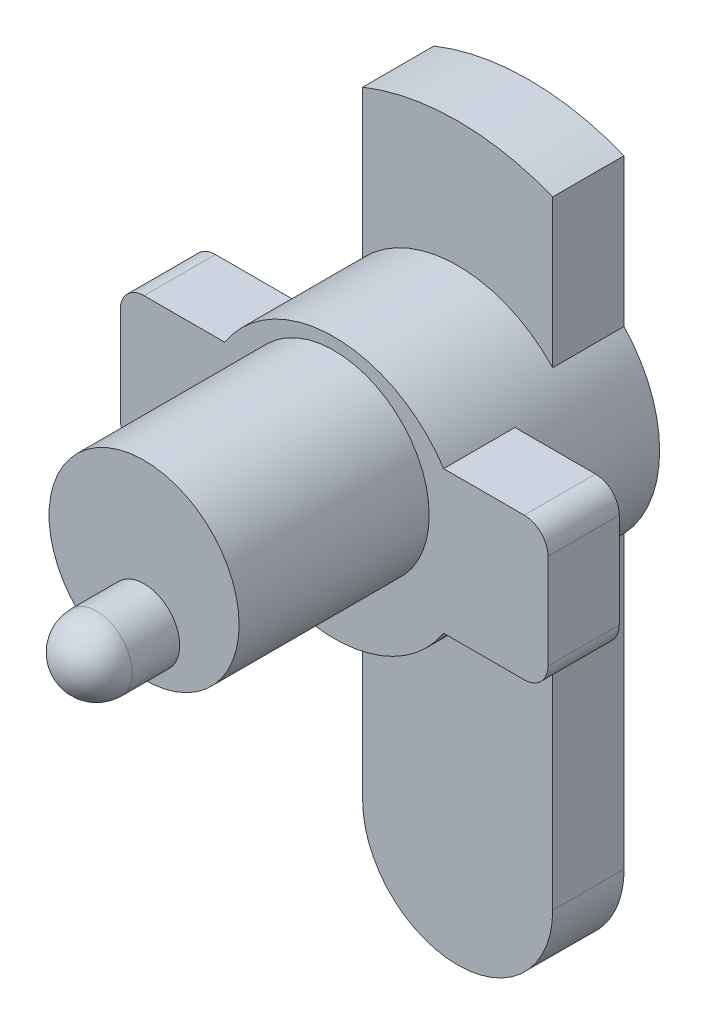
ISO-10303-21;
HEADER;
FILE_DESCRIPTION(('STEP AP214'),'2;1');
FILE_NAME('part.step','',(''),(''),'','','');
FILE_SCHEMA(('AUTOMOTIVE_DESIGN { 1 0 10303 214 1 1 1 1 }'));
ENDSEC;
DATA;
#1=APPLICATION_CONTEXT('core data for automotive mechanical design processes');
#2=APPLICATION_PROTOCOL_DEFINITION('international standard','automotive_design',2000,#1);
#3=PRODUCT_CONTEXT('',#1,'mechanical');
#4=PRODUCT('Part','Part','',(#3));
#5=PRODUCT_RELATED_PRODUCT_CATEGORY('part','',(#4));
#6=PRODUCT_DEFINITION_FORMATION('','',#4);
#7=PRODUCT_DEFINITION_CONTEXT('part definition',#1,'design');
#8=PRODUCT_DEFINITION('design','',#6,#7);
#9=PRODUCT_DEFINITION_SHAPE('','',#8);
#10=(LENGTH_UNIT() NAMED_UNIT(*) SI_UNIT(.MILLI.,.METRE.));
#11=(NAMED_UNIT(*) PLANE_ANGLE_UNIT() SI_UNIT($,.RADIAN.));
#12=(NAMED_UNIT(*) SI_UNIT($,.STERADIAN.) SOLID_ANGLE_UNIT());
#13=UNCERTAINTY_MEASURE_WITH_UNIT(LENGTH_MEASURE(1.E-05),#10,'distance_accuracy_value','');
#14=(GEOMETRIC_REPRESENTATION_CONTEXT(3) GLOBAL_UNCERTAINTY_ASSIGNED_CONTEXT((#13)) GLOBAL_UNIT_ASSIGNED_CONTEXT((#10,
#11,#12)) REPRESENTATION_CONTEXT('',''));
#15=CARTESIAN_POINT('',(0.,0.,0.));
#16=DIRECTION('',(0.,0.,1.));
#17=DIRECTION('',(1.,0.,0.));
#18=AXIS2_PLACEMENT_3D('',#15,#16,#17);
#19=CARTESIAN_POINT('',(0.,0.,0.));
#20=DIRECTION('',(0.,0.,1.));
#21=DIRECTION('',(1.,0.,0.));
#22=AXIS2_PLACEMENT_3D('',#19,#20,#21);
#23=PLANE('',#22);
#24=DIRECTION('',(0.,-1.,0.));
#25=VECTOR('',#24,1.);
#26=CARTESIAN_POINT('',(0.5,-9.5,0.));
#27=LINE('',#26,#25);
#28=CARTESIAN_POINT('',(0.5,-1.5,0.));
#29=VERTEX_POINT('',#28);
#30=CARTESIAN_POINT('',(0.5,-9.5,0.));
#31=VERTEX_POINT('',#30);
#32=EDGE_CURVE('E232',#29,#31,#27,.T.);
#33=ORIENTED_EDGE('',*,*,#32,.F.);
#34=CARTESIAN_POINT('',(0.,-1.5,0.));
#35=DIRECTION('',(0.,0.,-1.));
#36=DIRECTION('',(-1.,0.,0.));
#37=AXIS2_PLACEMENT_3D('',#34,#35,#36);
#38=CIRCLE('',#37,0.5);
#39=CARTESIAN_POINT('',(0.,-1.,0.));
#40=VERTEX_POINT('',#39);
#41=EDGE_CURVE('E234',#40,#29,#38,.T.);
#42=ORIENTED_EDGE('',*,*,#41,.F.);
#43=CARTESIAN_POINT('',(0.,0.5,0.));
#44=DIRECTION('',(0.,0.,-1.));
#45=DIRECTION('',(-1.,0.,0.));
#46=AXIS2_PLACEMENT_3D('',#43,#44,#45);
#47=CIRCLE('',#46,1.5);
#48=EDGE_CURVE('E231',#40,#40,#47,.T.);
#49=ORIENTED_EDGE('',*,*,#48,.F.);
#50=CARTESIAN_POINT('',(-0.5,-1.5,0.));
#51=VERTEX_POINT('',#50);
#52=EDGE_CURVE('E219',#51,#40,#38,.T.);
#53=ORIENTED_EDGE('',*,*,#52,.F.);
#54=DIRECTION('',(0.,1.,0.));
#55=VECTOR('',#54,1.);
#56=CARTESIAN_POINT('',(-0.5,-9.5,0.));
#57=LINE('',#56,#55);
#58=CARTESIAN_POINT('',(-0.5,-9.5,0.));
#59=VERTEX_POINT('',#58);
#60=EDGE_CURVE('E228',#59,#51,#57,.T.);
#61=ORIENTED_EDGE('',*,*,#60,.F.);
#62=CARTESIAN_POINT('',(0.,-9.5,0.));
#63=DIRECTION('',(0.,0.,-1.));
#64=DIRECTION('',(-1.,0.,0.));
#65=AXIS2_PLACEMENT_3D('',#62,#63,#64);
#66=CIRCLE('',#65,0.5);
#67=CARTESIAN_POINT('',(0.,-10.,0.));
#68=VERTEX_POINT('',#67);
#69=EDGE_CURVE('E240',#68,#59,#66,.T.);
#70=ORIENTED_EDGE('',*,*,#69,.F.);
#71=CARTESIAN_POINT('',(0.,-8.,0.));
#72=DIRECTION('',(0.,0.,1.));
#73=DIRECTION('',(-1.,0.,0.));
#74=AXIS2_PLACEMENT_3D('',#71,#72,#73);
#75=CIRCLE('',#74,2.);
#76=CARTESIAN_POINT('',(-2.,-8.,0.));
#77=VERTEX_POINT('',#76);
#78=EDGE_CURVE('E281',#77,#68,#75,.T.);
#79=ORIENTED_EDGE('',*,*,#78,.F.);
#80=DIRECTION('',(0.,-1.,0.));
#81=VECTOR('',#80,1.);
#82=CARTESIAN_POINT('',(-2.,-8.,0.));
#83=LINE('',#82,#81);
#84=CARTESIAN_POINT('',(-2.,-1.88745860881769,0.));
#85=VERTEX_POINT('',#84);
#86=EDGE_CURVE('E276',#85,#77,#83,.T.);
#87=ORIENTED_EDGE('',*,*,#86,.F.);
#88=CARTESIAN_POINT('',(0.,0.,0.));
#89=DIRECTION('',(0.,0.,1.));
#90=DIRECTION('',(1.,0.,0.));
#91=AXIS2_PLACEMENT_3D('',#88,#89,#90);
#92=CIRCLE('',#91,2.75);
#93=CARTESIAN_POINT('',(-2.,1.88745860881768,0.));
#94=VERTEX_POINT('',#93);
#95=EDGE_CURVE('E367',#94,#85,#92,.T.);
#96=ORIENTED_EDGE('',*,*,#95,.F.);
#97=CARTESIAN_POINT('',(-2.,5.,0.));
#98=VERTEX_POINT('',#97);
#99=EDGE_CURVE('E277',#98,#94,#83,.T.);
#100=ORIENTED_EDGE('',*,*,#99,.F.);
#101=CARTESIAN_POINT('',(0.,0.,0.));
#102=DIRECTION('',(0.,0.,1.));
#103=DIRECTION('',(-1.,0.,0.));
#104=AXIS2_PLACEMENT_3D('',#101,#102,#103);
#105=CIRCLE('',#104,5.3851648071345);
#106=CARTESIAN_POINT('',(2.,5.,0.));
#107=VERTEX_POINT('',#106);
#108=EDGE_CURVE('E258',#107,#98,#105,.T.);
#109=ORIENTED_EDGE('',*,*,#108,.F.);
#110=DIRECTION('',(0.,1.,0.));
#111=VECTOR('',#110,1.);
#112=CARTESIAN_POINT('',(2.,-8.,0.));
#113=LINE('',#112,#111);
#114=CARTESIAN_POINT('',(2.,1.88745860881769,0.));
#115=VERTEX_POINT('',#114);
#116=EDGE_CURVE('E284',#115,#107,#113,.T.);
#117=ORIENTED_EDGE('',*,*,#116,.F.);
#118=CARTESIAN_POINT('',(2.,-1.88745860881769,0.));
#119=VERTEX_POINT('',#118);
#120=EDGE_CURVE('E360',#119,#115,#92,.T.);
#121=ORIENTED_EDGE('',*,*,#120,.F.);
#122=CARTESIAN_POINT('',(2.,-8.,0.));
#123=VERTEX_POINT('',#122);
#124=EDGE_CURVE('E263',#123,#119,#113,.T.);
#125=ORIENTED_EDGE('',*,*,#124,.F.);
#126=EDGE_CURVE('E280',#68,#123,#75,.T.);
#127=ORIENTED_EDGE('',*,*,#126,.F.);
#128=EDGE_CURVE('E236',#31,#68,#66,.T.);
#129=ORIENTED_EDGE('',*,*,#128,.F.);
#130=EDGE_LOOP('',(#33,#42,#49,#53,#61,#70,#79,#87,#96,#100,#109,#117,#121,#125,#127,#129));
#131=FACE_BOUND('',#130,.T.);
#132=ADVANCED_FACE('F37',(#131),#23,.F.);
#133=CARTESIAN_POINT('',(0.,0.,4.1));
#134=DIRECTION('',(0.,0.,-1.));
#135=DIRECTION('',(-1.,0.,0.));
#136=AXIS2_PLACEMENT_3D('',#133,#134,#135);
#137=CYLINDRICAL_SURFACE('',#136,2.75);
#138=CARTESIAN_POINT('',(0.,0.,2.6));
#139=DIRECTION('',(0.,0.,-1.));
#140=DIRECTION('',(-1.,0.,0.));
#141=AXIS2_PLACEMENT_3D('',#138,#139,#140);
#142=CIRCLE('',#141,2.75);
#143=CARTESIAN_POINT('',(2.30488611432322,1.5,2.6));
#144=VERTEX_POINT('',#143);
#145=CARTESIAN_POINT('',(2.30488611432322,-1.5,2.6));
#146=VERTEX_POINT('',#145);
#147=EDGE_CURVE('E370',#144,#146,#142,.T.);
#148=ORIENTED_EDGE('',*,*,#147,.T.);
#149=DIRECTION('',(0.,0.,-1.));
#150=VECTOR('',#149,1.);
#151=CARTESIAN_POINT('',(2.30488611432322,-1.5,4.1));
#152=LINE('',#151,#150);
#153=CARTESIAN_POINT('',(2.30488611432322,-1.5,4.1));
#154=VERTEX_POINT('',#153);
#155=EDGE_CURVE('E354',#146,#154,#152,.F.);
#156=ORIENTED_EDGE('',*,*,#155,.T.);
#157=CARTESIAN_POINT('',(0.,0.,4.1));
#158=DIRECTION('',(0.,0.,1.));
#159=DIRECTION('',(1.,0.,0.));
#160=AXIS2_PLACEMENT_3D('',#157,#158,#159);
#161=CIRCLE('',#160,2.75);
#162=CARTESIAN_POINT('',(-2.30488611432322,-1.5,4.1));
#163=VERTEX_POINT('',#162);
#164=EDGE_CURVE('E365',#163,#154,#161,.T.);
#165=ORIENTED_EDGE('',*,*,#164,.F.);
#166=DIRECTION('',(0.,0.,-1.));
#167=VECTOR('',#166,1.);
#168=CARTESIAN_POINT('',(-2.30488611432322,-1.5,4.1));
#169=LINE('',#168,#167);
#170=CARTESIAN_POINT('',(-2.30488611432322,-1.5,2.6));
#171=VERTEX_POINT('',#170);
#172=EDGE_CURVE('E357',#163,#171,#169,.T.);
#173=ORIENTED_EDGE('',*,*,#172,.T.);
#174=CARTESIAN_POINT('',(-2.30488611432322,1.5,2.6));
#175=VERTEX_POINT('',#174);
#176=EDGE_CURVE('E364',#171,#175,#142,.T.);
#177=ORIENTED_EDGE('',*,*,#176,.T.);
#178=DIRECTION('',(0.,0.,-1.));
#179=VECTOR('',#178,1.);
#180=CARTESIAN_POINT('',(-2.30488611432322,1.5,4.1));
#181=LINE('',#180,#179);
#182=CARTESIAN_POINT('',(-2.30488611432322,1.5,4.1));
#183=VERTEX_POINT('',#182);
#184=EDGE_CURVE('E338',#175,#183,#181,.F.);
#185=ORIENTED_EDGE('',*,*,#184,.T.);
#186=CARTESIAN_POINT('',(2.30488611432322,1.5,4.1));
#187=VERTEX_POINT('',#186);
#188=EDGE_CURVE('E361',#187,#183,#161,.T.);
#189=ORIENTED_EDGE('',*,*,#188,.F.);
#190=DIRECTION('',(0.,0.,-1.));
#191=VECTOR('',#190,1.);
#192=CARTESIAN_POINT('',(2.30488611432322,1.5,4.1));
#193=LINE('',#192,#191);
#194=EDGE_CURVE('E351',#187,#144,#193,.T.);
#195=ORIENTED_EDGE('',*,*,#194,.T.);
#196=EDGE_LOOP('',(#148,#156,#165,#173,#177,#185,#189,#195));
#197=FACE_BOUND('',#196,.T.);
#198=DIRECTION('',(0.,0.,-1.));
#199=VECTOR('',#198,1.);
#200=CARTESIAN_POINT('',(-2.,1.88745860881769,4.1));
#201=LINE('',#200,#199);
#202=CARTESIAN_POINT('',(-2.,1.88745860881769,1.5));
#203=VERTEX_POINT('',#202);
#204=EDGE_CURVE('E304',#94,#203,#201,.F.);
#205=ORIENTED_EDGE('',*,*,#204,.F.);
#206=ORIENTED_EDGE('',*,*,#95,.T.);
#207=DIRECTION('',(0.,0.,-1.));
#208=VECTOR('',#207,1.);
#209=CARTESIAN_POINT('',(-2.,-1.88745860881769,4.1));
#210=LINE('',#209,#208);
#211=CARTESIAN_POINT('',(-2.,-1.88745860881769,1.5));
#212=VERTEX_POINT('',#211);
#213=EDGE_CURVE('E307',#212,#85,#210,.T.);
#214=ORIENTED_EDGE('',*,*,#213,.F.);
#215=CARTESIAN_POINT('',(0.,0.,1.5));
#216=DIRECTION('',(0.,0.,-1.));
#217=DIRECTION('',(-1.,0.,0.));
#218=AXIS2_PLACEMENT_3D('',#215,#216,#217);
#219=CIRCLE('',#218,2.75);
#220=CARTESIAN_POINT('',(2.,-1.88745860881769,1.5));
#221=VERTEX_POINT('',#220);
#222=EDGE_CURVE('E323',#221,#212,#219,.T.);
#223=ORIENTED_EDGE('',*,*,#222,.F.);
#224=DIRECTION('',(0.,0.,-1.));
#225=VECTOR('',#224,1.);
#226=CARTESIAN_POINT('',(2.,-1.88745860881769,4.1));
#227=LINE('',#226,#225);
#228=EDGE_CURVE('E298',#119,#221,#227,.F.);
#229=ORIENTED_EDGE('',*,*,#228,.F.);
#230=ORIENTED_EDGE('',*,*,#120,.T.);
#231=DIRECTION('',(0.,0.,-1.));
#232=VECTOR('',#231,1.);
#233=CARTESIAN_POINT('',(2.,1.88745860881769,4.1));
#234=LINE('',#233,#232);
#235=CARTESIAN_POINT('',(2.,1.88745860881769,1.5));
#236=VERTEX_POINT('',#235);
#237=EDGE_CURVE('E301',#236,#115,#234,.T.);
#238=ORIENTED_EDGE('',*,*,#237,.F.);
#239=EDGE_CURVE('E408',#203,#236,#219,.T.);
#240=ORIENTED_EDGE('',*,*,#239,.F.);
#241=EDGE_LOOP('',(#205,#206,#214,#223,#229,#230,#238,#240));
#242=FACE_BOUND('',#241,.T.);
#243=ADVANCED_FACE('F462',(#197,#242),#137,.T.);
#244=CARTESIAN_POINT('',(0.,0.,4.1));
#245=DIRECTION('',(0.,0.,1.));
#246=DIRECTION('',(1.,0.,0.));
#247=AXIS2_PLACEMENT_3D('',#244,#245,#246);
#248=PLANE('',#247);
#249=CARTESIAN_POINT('',(0.,0.5,4.1));
#250=DIRECTION('',(0.,0.,1.));
#251=DIRECTION('',(1.,0.,0.));
#252=AXIS2_PLACEMENT_3D('',#249,#250,#251);
#253=CIRCLE('',#252,2.);
#254=CARTESIAN_POINT('',(2.,0.5,4.1));
#255=VERTEX_POINT('',#254);
#256=EDGE_CURVE('E320',#255,#255,#253,.T.);
#257=ORIENTED_EDGE('',*,*,#256,.F.);
#258=EDGE_LOOP('',(#257));
#259=FACE_BOUND('',#258,.T.);
#260=DIRECTION('',(0.,-1.,0.));
#261=VECTOR('',#260,1.);
#262=CARTESIAN_POINT('',(-4.5,-1.5,4.1));
#263=LINE('',#262,#261);
#264=CARTESIAN_POINT('',(-4.5,1.,4.1));
#265=VERTEX_POINT('',#264);
#266=CARTESIAN_POINT('',(-4.5,-1.,4.1));
#267=VERTEX_POINT('',#266);
#268=EDGE_CURVE('E344',#265,#267,#263,.T.);
#269=ORIENTED_EDGE('',*,*,#268,.T.);
#270=CARTESIAN_POINT('',(-4.,-1.,4.1));
#271=DIRECTION('',(0.,0.,1.));
#272=DIRECTION('',(1.,0.,0.));
#273=AXIS2_PLACEMENT_3D('',#270,#271,#272);
#274=CIRCLE('',#273,0.5);
#275=CARTESIAN_POINT('',(-4.,-1.5,4.1));
#276=VERTEX_POINT('',#275);
#277=EDGE_CURVE('E382',#267,#276,#274,.T.);
#278=ORIENTED_EDGE('',*,*,#277,.T.);
#279=DIRECTION('',(1.,0.,0.));
#280=VECTOR('',#279,1.);
#281=CARTESIAN_POINT('',(-4.5,-1.5,4.1));
#282=LINE('',#281,#280);
#283=EDGE_CURVE('E329',#276,#163,#282,.T.);
#284=ORIENTED_EDGE('',*,*,#283,.T.);
#285=ORIENTED_EDGE('',*,*,#164,.T.);
#286=CARTESIAN_POINT('',(4.,-1.5,4.1));
#287=VERTEX_POINT('',#286);
#288=EDGE_CURVE('E347',#154,#287,#282,.T.);
#289=ORIENTED_EDGE('',*,*,#288,.T.);
#290=CARTESIAN_POINT('',(4.,-1.,4.1));
#291=DIRECTION('',(0.,0.,1.));
#292=DIRECTION('',(1.,0.,0.));
#293=AXIS2_PLACEMENT_3D('',#290,#291,#292);
#294=CIRCLE('',#293,0.5);
#295=CARTESIAN_POINT('',(4.5,-1.,4.1));
#296=VERTEX_POINT('',#295);
#297=EDGE_CURVE('E378',#287,#296,#294,.T.);
#298=ORIENTED_EDGE('',*,*,#297,.T.);
#299=DIRECTION('',(0.,1.,0.));
#300=VECTOR('',#299,1.);
#301=CARTESIAN_POINT('',(4.5,-1.5,4.1));
#302=LINE('',#301,#300);
#303=CARTESIAN_POINT('',(4.5,1.,4.1));
#304=VERTEX_POINT('',#303);
#305=EDGE_CURVE('E319',#296,#304,#302,.T.);
#306=ORIENTED_EDGE('',*,*,#305,.T.);
#307=CARTESIAN_POINT('',(4.,1.,4.1));
#308=DIRECTION('',(0.,0.,1.));
#309=DIRECTION('',(1.,0.,0.));
#310=AXIS2_PLACEMENT_3D('',#307,#308,#309);
#311=CIRCLE('',#310,0.5);
#312=CARTESIAN_POINT('',(4.,1.5,4.1));
#313=VERTEX_POINT('',#312);
#314=EDGE_CURVE('E376',#304,#313,#311,.T.);
#315=ORIENTED_EDGE('',*,*,#314,.T.);
#316=DIRECTION('',(-1.,0.,0.));
#317=VECTOR('',#316,1.);
#318=CARTESIAN_POINT('',(-4.5,1.5,4.1));
#319=LINE('',#318,#317);
#320=EDGE_CURVE('E342',#313,#187,#319,.T.);
#321=ORIENTED_EDGE('',*,*,#320,.T.);
#322=ORIENTED_EDGE('',*,*,#188,.T.);
#323=CARTESIAN_POINT('',(-4.,1.5,4.1));
#324=VERTEX_POINT('',#323);
#325=EDGE_CURVE('E341',#183,#324,#319,.T.);
#326=ORIENTED_EDGE('',*,*,#325,.T.);
#327=CARTESIAN_POINT('',(-4.,1.,4.1));
#328=DIRECTION('',(0.,0.,1.));
#329=DIRECTION('',(1.,0.,0.));
#330=AXIS2_PLACEMENT_3D('',#327,#328,#329);
#331=CIRCLE('',#330,0.5);
#332=EDGE_CURVE('E380',#324,#265,#331,.T.);
#333=ORIENTED_EDGE('',*,*,#332,.T.);
#334=EDGE_LOOP('',(#269,#278,#284,#285,#289,#298,#306,#315,#321,#322,#326,#333));
#335=FACE_BOUND('',#334,.T.);
#336=ADVANCED_FACE('F467',(#259,#335),#248,.T.);
#337=CARTESIAN_POINT('',(-4.5,-1.5,2.6));
#338=DIRECTION('',(-1.,0.,0.));
#339=DIRECTION('',(0.,0.,1.));
#340=AXIS2_PLACEMENT_3D('',#337,#338,#339);
#341=PLANE('',#340);
#342=DIRECTION('',(0.,-1.,0.));
#343=VECTOR('',#342,1.);
#344=CARTESIAN_POINT('',(-4.5,-1.5,2.6));
#345=LINE('',#344,#343);
#346=CARTESIAN_POINT('',(-4.5,1.,2.6));
#347=VERTEX_POINT('',#346);
#348=CARTESIAN_POINT('',(-4.5,-1.,2.6));
#349=VERTEX_POINT('',#348);
#350=EDGE_CURVE('E332',#347,#349,#345,.T.);
#351=ORIENTED_EDGE('',*,*,#350,.T.);
#352=DIRECTION('',(0.,0.,1.));
#353=VECTOR('',#352,1.);
#354=CARTESIAN_POINT('',(-4.5,-1.,2.6));
#355=LINE('',#354,#353);
#356=EDGE_CURVE('E373',#349,#267,#355,.T.);
#357=ORIENTED_EDGE('',*,*,#356,.T.);
#358=ORIENTED_EDGE('',*,*,#268,.F.);
#359=DIRECTION('',(0.,0.,1.));
#360=VECTOR('',#359,1.);
#361=CARTESIAN_POINT('',(-4.5,1.,2.6));
#362=LINE('',#361,#360);
#363=EDGE_CURVE('E371',#265,#347,#362,.F.);
#364=ORIENTED_EDGE('',*,*,#363,.T.);
#365=EDGE_LOOP('',(#351,#357,#358,#364));
#366=FACE_BOUND('',#365,.T.);
#367=ADVANCED_FACE('F645',(#366),#341,.T.);
#368=CARTESIAN_POINT('',(0.,0.,2.6));
#369=DIRECTION('',(0.,0.,-1.));
#370=DIRECTION('',(-1.,0.,0.));
#371=AXIS2_PLACEMENT_3D('',#368,#369,#370);
#372=PLANE('',#371);
#373=DIRECTION('',(1.,0.,0.));
#374=VECTOR('',#373,1.);
#375=CARTESIAN_POINT('',(-4.5,-1.5,2.6));
#376=LINE('',#375,#374);
#377=CARTESIAN_POINT('',(-4.,-1.5,2.6));
#378=VERTEX_POINT('',#377);
#379=EDGE_CURVE('E336',#378,#171,#376,.T.);
#380=ORIENTED_EDGE('',*,*,#379,.F.);
#381=CARTESIAN_POINT('',(-4.,-1.,2.6));
#382=DIRECTION('',(0.,0.,-1.));
#383=DIRECTION('',(-1.,0.,0.));
#384=AXIS2_PLACEMENT_3D('',#381,#382,#383);
#385=CIRCLE('',#384,0.5);
#386=EDGE_CURVE('E388',#378,#349,#385,.T.);
#387=ORIENTED_EDGE('',*,*,#386,.T.);
#388=ORIENTED_EDGE('',*,*,#350,.F.);
#389=CARTESIAN_POINT('',(-4.,1.,2.6));
#390=DIRECTION('',(0.,0.,-1.));
#391=DIRECTION('',(-1.,0.,0.));
#392=AXIS2_PLACEMENT_3D('',#389,#390,#391);
#393=CIRCLE('',#392,0.5);
#394=CARTESIAN_POINT('',(-4.,1.5,2.6));
#395=VERTEX_POINT('',#394);
#396=EDGE_CURVE('E386',#347,#395,#393,.T.);
#397=ORIENTED_EDGE('',*,*,#396,.T.);
#398=DIRECTION('',(-1.,0.,0.));
#399=VECTOR('',#398,1.);
#400=CARTESIAN_POINT('',(-4.5,1.5,2.6));
#401=LINE('',#400,#399);
#402=EDGE_CURVE('E328',#175,#395,#401,.T.);
#403=ORIENTED_EDGE('',*,*,#402,.F.);
#404=ORIENTED_EDGE('',*,*,#176,.F.);
#405=EDGE_LOOP('',(#380,#387,#388,#397,#403,#404));
#406=FACE_BOUND('',#405,.T.);
#407=ADVANCED_FACE('F641',(#406),#372,.T.);
#408=CARTESIAN_POINT('',(-4.5,1.5,2.6));
#409=DIRECTION('',(0.,1.,0.));
#410=DIRECTION('',(0.,0.,1.));
#411=AXIS2_PLACEMENT_3D('',#408,#409,#410);
#412=PLANE('',#411);
#413=ORIENTED_EDGE('',*,*,#402,.T.);
#414=DIRECTION('',(0.,0.,1.));
#415=VECTOR('',#414,1.);
#416=CARTESIAN_POINT('',(-4.,1.5,2.6));
#417=LINE('',#416,#415);
#418=EDGE_CURVE('E390',#395,#324,#417,.T.);
#419=ORIENTED_EDGE('',*,*,#418,.T.);
#420=ORIENTED_EDGE('',*,*,#325,.F.);
#421=ORIENTED_EDGE('',*,*,#184,.F.);
#422=EDGE_LOOP('',(#413,#419,#420,#421));
#423=FACE_BOUND('',#422,.T.);
#424=ADVANCED_FACE('F644',(#423),#412,.T.);
#425=CARTESIAN_POINT('',(-4.5,-1.5,2.6));
#426=DIRECTION('',(0.,-1.,0.));
#427=DIRECTION('',(0.,0.,-1.));
#428=AXIS2_PLACEMENT_3D('',#425,#426,#427);
#429=PLANE('',#428);
#430=ORIENTED_EDGE('',*,*,#283,.F.);
#431=DIRECTION('',(0.,0.,1.));
#432=VECTOR('',#431,1.);
#433=CARTESIAN_POINT('',(-4.,-1.5,2.6));
#434=LINE('',#433,#432);
#435=EDGE_CURVE('E384',#276,#378,#434,.F.);
#436=ORIENTED_EDGE('',*,*,#435,.T.);
#437=ORIENTED_EDGE('',*,*,#379,.T.);
#438=ORIENTED_EDGE('',*,*,#172,.F.);
#439=EDGE_LOOP('',(#430,#436,#437,#438));
#440=FACE_BOUND('',#439,.T.);
#441=ADVANCED_FACE('F648',(#440),#429,.T.);
#442=DIRECTION('',(0.,1.,0.));
#443=VECTOR('',#442,1.);
#444=CARTESIAN_POINT('',(4.5,-1.5,2.6));
#445=LINE('',#444,#443);
#446=CARTESIAN_POINT('',(4.5,-1.,2.6));
#447=VERTEX_POINT('',#446);
#448=CARTESIAN_POINT('',(4.5,1.,2.6));
#449=VERTEX_POINT('',#448);
#450=EDGE_CURVE('E325',#447,#449,#445,.T.);
#451=ORIENTED_EDGE('',*,*,#450,.F.);
#452=CARTESIAN_POINT('',(4.,-1.,2.6));
#453=DIRECTION('',(0.,0.,-1.));
#454=DIRECTION('',(-1.,0.,0.));
#455=AXIS2_PLACEMENT_3D('',#452,#453,#454);
#456=CIRCLE('',#455,0.5);
#457=CARTESIAN_POINT('',(4.,-1.5,2.6));
#458=VERTEX_POINT('',#457);
#459=EDGE_CURVE('E403',#447,#458,#456,.T.);
#460=ORIENTED_EDGE('',*,*,#459,.T.);
#461=EDGE_CURVE('E335',#146,#458,#376,.T.);
#462=ORIENTED_EDGE('',*,*,#461,.F.);
#463=ORIENTED_EDGE('',*,*,#147,.F.);
#464=CARTESIAN_POINT('',(4.,1.5,2.6));
#465=VERTEX_POINT('',#464);
#466=EDGE_CURVE('E330',#465,#144,#401,.T.);
#467=ORIENTED_EDGE('',*,*,#466,.F.);
#468=CARTESIAN_POINT('',(4.,1.,2.6));
#469=DIRECTION('',(0.,0.,-1.));
#470=DIRECTION('',(-1.,0.,0.));
#471=AXIS2_PLACEMENT_3D('',#468,#469,#470);
#472=CIRCLE('',#471,0.5);
#473=EDGE_CURVE('E401',#465,#449,#472,.T.);
#474=ORIENTED_EDGE('',*,*,#473,.T.);
#475=EDGE_LOOP('',(#451,#460,#462,#463,#467,#474));
#476=FACE_BOUND('',#475,.T.);
#477=ADVANCED_FACE('F647',(#476),#372,.T.);
#478=ORIENTED_EDGE('',*,*,#461,.T.);
#479=DIRECTION('',(0.,0.,1.));
#480=VECTOR('',#479,1.);
#481=CARTESIAN_POINT('',(4.,-1.5,2.6));
#482=LINE('',#481,#480);
#483=EDGE_CURVE('E393',#458,#287,#482,.T.);
#484=ORIENTED_EDGE('',*,*,#483,.T.);
#485=ORIENTED_EDGE('',*,*,#288,.F.);
#486=ORIENTED_EDGE('',*,*,#155,.F.);
#487=EDGE_LOOP('',(#478,#484,#485,#486));
#488=FACE_BOUND('',#487,.T.);
#489=ADVANCED_FACE('F652',(#488),#429,.T.);
#490=ORIENTED_EDGE('',*,*,#320,.F.);
#491=DIRECTION('',(0.,0.,1.));
#492=VECTOR('',#491,1.);
#493=CARTESIAN_POINT('',(4.,1.5,2.6));
#494=LINE('',#493,#492);
#495=EDGE_CURVE('E324',#313,#465,#494,.F.);
#496=ORIENTED_EDGE('',*,*,#495,.T.);
#497=ORIENTED_EDGE('',*,*,#466,.T.);
#498=ORIENTED_EDGE('',*,*,#194,.F.);
#499=EDGE_LOOP('',(#490,#496,#497,#498));
#500=FACE_BOUND('',#499,.T.);
#501=ADVANCED_FACE('F656',(#500),#412,.T.);
#502=CARTESIAN_POINT('',(4.5,-1.5,2.6));
#503=DIRECTION('',(1.,0.,0.));
#504=DIRECTION('',(0.,0.,-1.));
#505=AXIS2_PLACEMENT_3D('',#502,#503,#504);
#506=PLANE('',#505);
#507=ORIENTED_EDGE('',*,*,#305,.F.);
#508=DIRECTION('',(0.,0.,1.));
#509=VECTOR('',#508,1.);
#510=CARTESIAN_POINT('',(4.5,-1.,2.6));
#511=LINE('',#510,#509);
#512=EDGE_CURVE('E399',#296,#447,#511,.F.);
#513=ORIENTED_EDGE('',*,*,#512,.T.);
#514=ORIENTED_EDGE('',*,*,#450,.T.);
#515=DIRECTION('',(0.,0.,1.));
#516=VECTOR('',#515,1.);
#517=CARTESIAN_POINT('',(4.5,1.,2.6));
#518=LINE('',#517,#516);
#519=EDGE_CURVE('E396',#449,#304,#518,.T.);
#520=ORIENTED_EDGE('',*,*,#519,.T.);
#521=EDGE_LOOP('',(#507,#513,#514,#520));
#522=FACE_BOUND('',#521,.T.);
#523=ADVANCED_FACE('F477',(#522),#506,.T.);
#524=CARTESIAN_POINT('',(-4.,-1.,2.6));
#525=DIRECTION('',(0.,0.,1.));
#526=DIRECTION('',(1.,0.,0.));
#527=AXIS2_PLACEMENT_3D('',#524,#525,#526);
#528=CYLINDRICAL_SURFACE('',#527,0.5);
#529=ORIENTED_EDGE('',*,*,#386,.F.);
#530=ORIENTED_EDGE('',*,*,#435,.F.);
#531=ORIENTED_EDGE('',*,*,#277,.F.);
#532=ORIENTED_EDGE('',*,*,#356,.F.);
#533=EDGE_LOOP('',(#529,#530,#531,#532));
#534=FACE_BOUND('',#533,.T.);
#535=ADVANCED_FACE('F473',(#534),#528,.T.);
#536=CARTESIAN_POINT('',(-4.,1.,2.6));
#537=DIRECTION('',(0.,0.,1.));
#538=DIRECTION('',(1.,0.,0.));
#539=AXIS2_PLACEMENT_3D('',#536,#537,#538);
#540=CYLINDRICAL_SURFACE('',#539,0.5);
#541=ORIENTED_EDGE('',*,*,#396,.F.);
#542=ORIENTED_EDGE('',*,*,#363,.F.);
#543=ORIENTED_EDGE('',*,*,#332,.F.);
#544=ORIENTED_EDGE('',*,*,#418,.F.);
#545=EDGE_LOOP('',(#541,#542,#543,#544));
#546=FACE_BOUND('',#545,.T.);
#547=ADVANCED_FACE('F476',(#546),#540,.T.);
#548=CARTESIAN_POINT('',(4.,-1.,2.6));
#549=DIRECTION('',(0.,0.,1.));
#550=DIRECTION('',(1.,0.,0.));
#551=AXIS2_PLACEMENT_3D('',#548,#549,#550);
#552=CYLINDRICAL_SURFACE('',#551,0.5);
#553=ORIENTED_EDGE('',*,*,#459,.F.);
#554=ORIENTED_EDGE('',*,*,#512,.F.);
#555=ORIENTED_EDGE('',*,*,#297,.F.);
#556=ORIENTED_EDGE('',*,*,#483,.F.);
#557=EDGE_LOOP('',(#553,#554,#555,#556));
#558=FACE_BOUND('',#557,.T.);
#559=ADVANCED_FACE('F481',(#558),#552,.T.);
#560=CARTESIAN_POINT('',(4.,1.,2.6));
#561=DIRECTION('',(0.,0.,1.));
#562=DIRECTION('',(1.,0.,0.));
#563=AXIS2_PLACEMENT_3D('',#560,#561,#562);
#564=CYLINDRICAL_SURFACE('',#563,0.5);
#565=ORIENTED_EDGE('',*,*,#473,.F.);
#566=ORIENTED_EDGE('',*,*,#495,.F.);
#567=ORIENTED_EDGE('',*,*,#314,.F.);
#568=ORIENTED_EDGE('',*,*,#519,.F.);
#569=EDGE_LOOP('',(#565,#566,#567,#568));
#570=FACE_BOUND('',#569,.T.);
#571=ADVANCED_FACE('F485',(#570),#564,.T.);
#572=CARTESIAN_POINT('',(0.,0.5,8.1));
#573=DIRECTION('',(0.,0.,-1.));
#574=DIRECTION('',(-1.,0.,0.));
#575=AXIS2_PLACEMENT_3D('',#572,#573,#574);
#576=CYLINDRICAL_SURFACE('',#575,2.);
#577=CARTESIAN_POINT('',(0.,0.5,8.1));
#578=DIRECTION('',(0.,0.,1.));
#579=DIRECTION('',(1.,0.,0.));
#580=AXIS2_PLACEMENT_3D('',#577,#578,#579);
#581=CIRCLE('',#580,2.);
#582=CARTESIAN_POINT('',(2.,0.5,8.1));
#583=VERTEX_POINT('',#582);
#584=EDGE_CURVE('E314',#583,#583,#581,.T.);
#585=ORIENTED_EDGE('',*,*,#584,.F.);
#586=EDGE_LOOP('',(#585));
#587=FACE_BOUND('',#586,.T.);
#588=ORIENTED_EDGE('',*,*,#256,.T.);
#589=EDGE_LOOP('',(#588));
#590=FACE_BOUND('',#589,.T.);
#591=ADVANCED_FACE('F489',(#587,#590),#576,.T.);
#592=CARTESIAN_POINT('',(0.,0.5,8.1));
#593=DIRECTION('',(0.,0.,1.));
#594=DIRECTION('',(1.,0.,0.));
#595=AXIS2_PLACEMENT_3D('',#592,#593,#594);
#596=PLANE('',#595);
#597=CARTESIAN_POINT('',(0.,-0.5,8.1));
#598=DIRECTION('',(0.,0.,1.));
#599=DIRECTION('',(1.,0.,0.));
#600=AXIS2_PLACEMENT_3D('',#597,#598,#599);
#601=CIRCLE('',#600,0.75);
#602=CARTESIAN_POINT('',(0.75,-0.5,8.1));
#603=VERTEX_POINT('',#602);
#604=EDGE_CURVE('E310',#603,#603,#601,.T.);
#605=ORIENTED_EDGE('',*,*,#604,.F.);
#606=EDGE_LOOP('',(#605));
#607=FACE_BOUND('',#606,.T.);
#608=ORIENTED_EDGE('',*,*,#584,.T.);
#609=EDGE_LOOP('',(#608));
#610=FACE_BOUND('',#609,.T.);
#611=ADVANCED_FACE('F633',(#607,#610),#596,.T.);
#612=CARTESIAN_POINT('',(0.,-0.5,9.1));
#613=DIRECTION('',(0.,0.,-1.));
#614=DIRECTION('',(-1.,0.,0.));
#615=AXIS2_PLACEMENT_3D('',#612,#613,#614);
#616=CYLINDRICAL_SURFACE('',#615,0.75);
#617=CARTESIAN_POINT('',(0.,-0.5,9.1));
#618=DIRECTION('',(0.,0.,1.));
#619=DIRECTION('',(1.,0.,0.));
#620=AXIS2_PLACEMENT_3D('',#617,#618,#619);
#621=CIRCLE('',#620,0.75);
#622=CARTESIAN_POINT('',(0.75,-0.5,9.1));
#623=VERTEX_POINT('',#622);
#624=EDGE_CURVE('E311',#623,#623,#621,.T.);
#625=ORIENTED_EDGE('',*,*,#624,.F.);
#626=EDGE_LOOP('',(#625));
#627=FACE_BOUND('',#626,.T.);
#628=ORIENTED_EDGE('',*,*,#604,.T.);
#629=EDGE_LOOP('',(#628));
#630=FACE_BOUND('',#629,.T.);
#631=ADVANCED_FACE('F629',(#627,#630),#616,.T.);
#632=CARTESIAN_POINT('',(0.,-0.5,9.1));
#633=DIRECTION('',(0.,1.,0.));
#634=DIRECTION('',(-1.,0.,0.));
#635=AXIS2_PLACEMENT_3D('',#632,#633,#634);
#636=SPHERICAL_SURFACE('',#635,0.75);
#637=CARTESIAN_POINT('',(0.,-0.5,9.1));
#638=DIRECTION('',(0.,0.,1.));
#639=DIRECTION('',(1.,0.,0.));
#640=AXIS2_PLACEMENT_3D('',#637,#638,#639);
#641=SPHERICAL_SURFACE('',#640,0.75);
#642=ORIENTED_EDGE('',*,*,#624,.T.);
#643=EDGE_LOOP('',(#642));
#644=FACE_BOUND('',#643,.T.);
#645=ADVANCED_FACE('F569',(#644),#641,.T.);
#646=CARTESIAN_POINT('',(0.,-8.,1.5));
#647=DIRECTION('',(0.,0.,-1.));
#648=DIRECTION('',(-1.,0.,0.));
#649=AXIS2_PLACEMENT_3D('',#646,#647,#648);
#650=CYLINDRICAL_SURFACE('',#649,2.);
#651=ORIENTED_EDGE('',*,*,#78,.T.);
#652=ORIENTED_EDGE('',*,*,#126,.T.);
#653=DIRECTION('',(0.,0.,-1.));
#654=VECTOR('',#653,1.);
#655=CARTESIAN_POINT('',(2.,-8.,1.5));
#656=LINE('',#655,#654);
#657=CARTESIAN_POINT('',(2.,-8.,1.5));
#658=VERTEX_POINT('',#657);
#659=EDGE_CURVE('E289',#658,#123,#656,.T.);
#660=ORIENTED_EDGE('',*,*,#659,.F.);
#661=CARTESIAN_POINT('',(0.,-8.,1.5));
#662=DIRECTION('',(0.,0.,1.));
#663=DIRECTION('',(-1.,0.,0.));
#664=AXIS2_PLACEMENT_3D('',#661,#662,#663);
#665=CIRCLE('',#664,2.);
#666=CARTESIAN_POINT('',(-2.,-8.,1.5));
#667=VERTEX_POINT('',#666);
#668=EDGE_CURVE('E267',#667,#658,#665,.T.);
#669=ORIENTED_EDGE('',*,*,#668,.F.);
#670=DIRECTION('',(0.,0.,-1.));
#671=VECTOR('',#670,1.);
#672=CARTESIAN_POINT('',(-2.,-8.,1.5));
#673=LINE('',#672,#671);
#674=EDGE_CURVE('E292',#667,#77,#673,.T.);
#675=ORIENTED_EDGE('',*,*,#674,.T.);
#676=EDGE_LOOP('',(#651,#652,#660,#669,#675));
#677=FACE_BOUND('',#676,.T.);
#678=ADVANCED_FACE('F564',(#677),#650,.T.);
#679=CARTESIAN_POINT('',(0.,0.,1.5));
#680=DIRECTION('',(0.,0.,-1.));
#681=DIRECTION('',(-1.,0.,0.));
#682=AXIS2_PLACEMENT_3D('',#679,#680,#681);
#683=PLANE('',#682);
#684=DIRECTION('',(0.,1.,0.));
#685=VECTOR('',#684,1.);
#686=CARTESIAN_POINT('',(2.,-8.,1.5));
#687=LINE('',#686,#685);
#688=EDGE_CURVE('E270',#658,#221,#687,.T.);
#689=ORIENTED_EDGE('',*,*,#688,.T.);
#690=ORIENTED_EDGE('',*,*,#222,.T.);
#691=DIRECTION('',(0.,-1.,0.));
#692=VECTOR('',#691,1.);
#693=CARTESIAN_POINT('',(-2.,-8.,1.5));
#694=LINE('',#693,#692);
#695=EDGE_CURVE('E262',#212,#667,#694,.T.);
#696=ORIENTED_EDGE('',*,*,#695,.T.);
#697=ORIENTED_EDGE('',*,*,#668,.T.);
#698=EDGE_LOOP('',(#689,#690,#696,#697));
#699=FACE_BOUND('',#698,.T.);
#700=ADVANCED_FACE('F568',(#699),#683,.F.);
#701=CARTESIAN_POINT('',(2.,-8.,1.5));
#702=DIRECTION('',(-1.,0.,0.));
#703=DIRECTION('',(0.,0.,1.));
#704=AXIS2_PLACEMENT_3D('',#701,#702,#703);
#705=PLANE('',#704);
#706=ORIENTED_EDGE('',*,*,#124,.T.);
#707=ORIENTED_EDGE('',*,*,#228,.T.);
#708=ORIENTED_EDGE('',*,*,#688,.F.);
#709=ORIENTED_EDGE('',*,*,#659,.T.);
#710=EDGE_LOOP('',(#706,#707,#708,#709));
#711=FACE_BOUND('',#710,.T.);
#712=ADVANCED_FACE('F614',(#711),#705,.F.);
#713=CARTESIAN_POINT('',(-2.,-8.,1.5));
#714=DIRECTION('',(1.,0.,0.));
#715=DIRECTION('',(0.,0.,-1.));
#716=AXIS2_PLACEMENT_3D('',#713,#714,#715);
#717=PLANE('',#716);
#718=ORIENTED_EDGE('',*,*,#695,.F.);
#719=ORIENTED_EDGE('',*,*,#213,.T.);
#720=ORIENTED_EDGE('',*,*,#86,.T.);
#721=ORIENTED_EDGE('',*,*,#674,.F.);
#722=EDGE_LOOP('',(#718,#719,#720,#721));
#723=FACE_BOUND('',#722,.T.);
#724=ADVANCED_FACE('F622',(#723),#717,.F.);
#725=CARTESIAN_POINT('',(-2.,5.,1.5));
#726=VERTEX_POINT('',#725);
#727=EDGE_CURVE('E264',#726,#203,#694,.T.);
#728=ORIENTED_EDGE('',*,*,#727,.T.);
#729=ORIENTED_EDGE('',*,*,#239,.T.);
#730=CARTESIAN_POINT('',(2.,5.,1.5));
#731=VERTEX_POINT('',#730);
#732=EDGE_CURVE('E269',#236,#731,#687,.T.);
#733=ORIENTED_EDGE('',*,*,#732,.T.);
#734=CARTESIAN_POINT('',(0.,0.,1.5));
#735=DIRECTION('',(0.,0.,1.));
#736=DIRECTION('',(-1.,0.,0.));
#737=AXIS2_PLACEMENT_3D('',#734,#735,#736);
#738=CIRCLE('',#737,5.3851648071345);
#739=EDGE_CURVE('E259',#731,#726,#738,.T.);
#740=ORIENTED_EDGE('',*,*,#739,.T.);
#741=EDGE_LOOP('',(#728,#729,#733,#740));
#742=FACE_BOUND('',#741,.T.);
#743=ADVANCED_FACE('F616',(#742),#683,.F.);
#744=ORIENTED_EDGE('',*,*,#99,.T.);
#745=ORIENTED_EDGE('',*,*,#204,.T.);
#746=ORIENTED_EDGE('',*,*,#727,.F.);
#747=DIRECTION('',(0.,0.,-1.));
#748=VECTOR('',#747,1.);
#749=CARTESIAN_POINT('',(-2.,5.,1.5));
#750=LINE('',#749,#748);
#751=EDGE_CURVE('E295',#726,#98,#750,.T.);
#752=ORIENTED_EDGE('',*,*,#751,.T.);
#753=EDGE_LOOP('',(#744,#745,#746,#752));
#754=FACE_BOUND('',#753,.T.);
#755=ADVANCED_FACE('F619',(#754),#717,.F.);
#756=ORIENTED_EDGE('',*,*,#732,.F.);
#757=ORIENTED_EDGE('',*,*,#237,.T.);
#758=ORIENTED_EDGE('',*,*,#116,.T.);
#759=DIRECTION('',(0.,0.,-1.));
#760=VECTOR('',#759,1.);
#761=CARTESIAN_POINT('',(2.,5.,1.5));
#762=LINE('',#761,#760);
#763=EDGE_CURVE('E273',#731,#107,#762,.T.);
#764=ORIENTED_EDGE('',*,*,#763,.F.);
#765=EDGE_LOOP('',(#756,#757,#758,#764));
#766=FACE_BOUND('',#765,.T.);
#767=ADVANCED_FACE('F617',(#766),#705,.F.);
#768=CARTESIAN_POINT('',(0.,0.,1.5));
#769=DIRECTION('',(0.,0.,-1.));
#770=DIRECTION('',(-1.,0.,0.));
#771=AXIS2_PLACEMENT_3D('',#768,#769,#770);
#772=CYLINDRICAL_SURFACE('',#771,5.3851648071345);
#773=ORIENTED_EDGE('',*,*,#108,.T.);
#774=ORIENTED_EDGE('',*,*,#751,.F.);
#775=ORIENTED_EDGE('',*,*,#739,.F.);
#776=ORIENTED_EDGE('',*,*,#763,.T.);
#777=EDGE_LOOP('',(#773,#774,#775,#776));
#778=FACE_BOUND('',#777,.T.);
#779=ADVANCED_FACE('F611',(#778),#772,.T.);
#780=CARTESIAN_POINT('',(0.,0.,3.1));
#781=DIRECTION('',(0.,0.,1.));
#782=DIRECTION('',(1.,0.,0.));
#783=AXIS2_PLACEMENT_3D('',#780,#781,#782);
#784=PLANE('',#783);
#785=CARTESIAN_POINT('',(0.,0.5,3.1));
#786=DIRECTION('',(0.,0.,-1.));
#787=DIRECTION('',(-1.,0.,0.));
#788=AXIS2_PLACEMENT_3D('',#785,#786,#787);
#789=CIRCLE('',#788,0.5);
#790=CARTESIAN_POINT('',(-0.5,0.5,3.1));
#791=VERTEX_POINT('',#790);
#792=EDGE_CURVE('E248',#791,#791,#789,.T.);
#793=ORIENTED_EDGE('',*,*,#792,.F.);
#794=EDGE_LOOP('',(#793));
#795=FACE_BOUND('',#794,.T.);
#796=CARTESIAN_POINT('',(0.,0.5,3.1));
#797=DIRECTION('',(0.,0.,1.));
#798=DIRECTION('',(1.,0.,0.));
#799=AXIS2_PLACEMENT_3D('',#796,#797,#798);
#800=CIRCLE('',#799,1.5);
#801=CARTESIAN_POINT('',(1.5,0.5,3.1));
#802=VERTEX_POINT('',#801);
#803=EDGE_CURVE('E255',#802,#802,#800,.F.);
#804=ORIENTED_EDGE('',*,*,#803,.T.);
#805=EDGE_LOOP('',(#804));
#806=FACE_BOUND('',#805,.T.);
#807=ADVANCED_FACE('F584',(#795,#806),#784,.F.);
#808=CARTESIAN_POINT('',(0.,0.5,8.34264068711929));
#809=DIRECTION('',(0.,0.,-1.));
#810=DIRECTION('',(-1.,0.,0.));
#811=AXIS2_PLACEMENT_3D('',#808,#809,#810);
#812=CYLINDRICAL_SURFACE('',#811,1.5);
#813=ORIENTED_EDGE('',*,*,#48,.T.);
#814=EDGE_LOOP('',(#813));
#815=FACE_BOUND('',#814,.T.);
#816=ORIENTED_EDGE('',*,*,#803,.F.);
#817=EDGE_LOOP('',(#816));
#818=FACE_BOUND('',#817,.T.);
#819=ADVANCED_FACE('F579',(#815,#818),#812,.F.);
#820=CARTESIAN_POINT('',(0.,0.5,7.1));
#821=DIRECTION('',(0.,0.,1.));
#822=DIRECTION('',(1.,0.,0.));
#823=AXIS2_PLACEMENT_3D('',#820,#821,#822);
#824=PLANE('',#823);
#825=CARTESIAN_POINT('',(0.,0.5,7.1));
#826=DIRECTION('',(0.,0.,1.));
#827=DIRECTION('',(1.,0.,0.));
#828=AXIS2_PLACEMENT_3D('',#825,#826,#827);
#829=CIRCLE('',#828,0.5);
#830=CARTESIAN_POINT('',(0.5,0.5,7.1));
#831=VERTEX_POINT('',#830);
#832=EDGE_CURVE('E251',#831,#831,#829,.F.);
#833=ORIENTED_EDGE('',*,*,#832,.T.);
#834=EDGE_LOOP('',(#833));
#835=FACE_BOUND('',#834,.T.);
#836=ADVANCED_FACE('F583',(#835),#824,.F.);
#837=CARTESIAN_POINT('',(0.,0.5,9.5142135623731));
#838=DIRECTION('',(0.,0.,-1.));
#839=DIRECTION('',(-1.,0.,0.));
#840=AXIS2_PLACEMENT_3D('',#837,#838,#839);
#841=CYLINDRICAL_SURFACE('',#840,0.5);
#842=ORIENTED_EDGE('',*,*,#792,.T.);
#843=EDGE_LOOP('',(#842));
#844=FACE_BOUND('',#843,.T.);
#845=ORIENTED_EDGE('',*,*,#832,.F.);
#846=EDGE_LOOP('',(#845));
#847=FACE_BOUND('',#846,.T.);
#848=ADVANCED_FACE('F548',(#844,#847),#841,.F.);
#849=CARTESIAN_POINT('',(0.,-9.5,-0.3));
#850=DIRECTION('',(0.,0.,1.));
#851=DIRECTION('',(1.,0.,0.));
#852=AXIS2_PLACEMENT_3D('',#849,#850,#851);
#853=CYLINDRICAL_SURFACE('',#852,0.5);
#854=DIRECTION('',(0.,0.,1.));
#855=VECTOR('',#854,1.);
#856=CARTESIAN_POINT('',(-0.5,-9.5,-0.3));
#857=LINE('',#856,#855);
#858=CARTESIAN_POINT('',(-0.5,-9.5,-0.2));
#859=VERTEX_POINT('',#858);
#860=EDGE_CURVE('E221',#859,#59,#857,.T.);
#861=ORIENTED_EDGE('',*,*,#860,.F.);
#862=CARTESIAN_POINT('',(0.,-9.5,-0.2));
#863=DIRECTION('',(0.,0.,-1.));
#864=DIRECTION('',(-1.,0.,0.));
#865=AXIS2_PLACEMENT_3D('',#862,#863,#864);
#866=CIRCLE('',#865,0.5);
#867=CARTESIAN_POINT('',(0.5,-9.5,-0.2));
#868=VERTEX_POINT('',#867);
#869=EDGE_CURVE('E12',#859,#868,#866,.F.);
#870=ORIENTED_EDGE('',*,*,#869,.T.);
#871=DIRECTION('',(0.,0.,1.));
#872=VECTOR('',#871,1.);
#873=CARTESIAN_POINT('',(0.5,-9.5,-0.3));
#874=LINE('',#873,#872);
#875=EDGE_CURVE('E244',#868,#31,#874,.T.);
#876=ORIENTED_EDGE('',*,*,#875,.T.);
#877=ORIENTED_EDGE('',*,*,#128,.T.);
#878=ORIENTED_EDGE('',*,*,#69,.T.);
#879=EDGE_LOOP('',(#861,#870,#876,#877,#878));
#880=FACE_BOUND('',#879,.T.);
#881=ADVANCED_FACE('F444',(#880),#853,.T.);
#882=CARTESIAN_POINT('',(-0.5,-9.5,-0.3));
#883=DIRECTION('',(1.,0.,0.));
#884=DIRECTION('',(0.,0.,-1.));
#885=AXIS2_PLACEMENT_3D('',#882,#883,#884);
#886=PLANE('',#885);
#887=DIRECTION('',(0.,0.,1.));
#888=VECTOR('',#887,1.);
#889=CARTESIAN_POINT('',(-0.5,-1.5,-0.3));
#890=LINE('',#889,#888);
#891=CARTESIAN_POINT('',(-0.5,-1.5,-0.2));
#892=VERTEX_POINT('',#891);
#893=EDGE_CURVE('E215',#892,#51,#890,.T.);
#894=ORIENTED_EDGE('',*,*,#893,.F.);
#895=DIRECTION('',(0.,1.,0.));
#896=VECTOR('',#895,1.);
#897=CARTESIAN_POINT('',(-0.5,-9.5,-0.2));
#898=LINE('',#897,#896);
#899=EDGE_CURVE('E46',#892,#859,#898,.F.);
#900=ORIENTED_EDGE('',*,*,#899,.T.);
#901=ORIENTED_EDGE('',*,*,#860,.T.);
#902=ORIENTED_EDGE('',*,*,#60,.T.);
#903=EDGE_LOOP('',(#894,#900,#901,#902));
#904=FACE_BOUND('',#903,.T.);
#905=ADVANCED_FACE('F235',(#904),#886,.F.);
#906=CARTESIAN_POINT('',(0.,-1.5,-0.3));
#907=DIRECTION('',(0.,0.,1.));
#908=DIRECTION('',(1.,0.,0.));
#909=AXIS2_PLACEMENT_3D('',#906,#907,#908);
#910=CYLINDRICAL_SURFACE('',#909,0.5);
#911=DIRECTION('',(0.,0.,1.));
#912=VECTOR('',#911,1.);
#913=CARTESIAN_POINT('',(0.5,-1.5,-0.3));
#914=LINE('',#913,#912);
#915=CARTESIAN_POINT('',(0.5,-1.5,-0.2));
#916=VERTEX_POINT('',#915);
#917=EDGE_CURVE('E222',#916,#29,#914,.T.);
#918=ORIENTED_EDGE('',*,*,#917,.F.);
#919=CARTESIAN_POINT('',(0.,-1.5,-0.2));
#920=DIRECTION('',(0.,0.,-1.));
#921=DIRECTION('',(-1.,0.,0.));
#922=AXIS2_PLACEMENT_3D('',#919,#920,#921);
#923=CIRCLE('',#922,0.5);
#924=EDGE_CURVE('E61',#916,#892,#923,.F.);
#925=ORIENTED_EDGE('',*,*,#924,.T.);
#926=ORIENTED_EDGE('',*,*,#893,.T.);
#927=ORIENTED_EDGE('',*,*,#52,.T.);
#928=ORIENTED_EDGE('',*,*,#41,.T.);
#929=EDGE_LOOP('',(#918,#925,#926,#927,#928));
#930=FACE_BOUND('',#929,.T.);
#931=ADVANCED_FACE('F217',(#930),#910,.T.);
#932=CARTESIAN_POINT('',(0.5,-9.5,-0.3));
#933=DIRECTION('',(-1.,0.,0.));
#934=DIRECTION('',(0.,0.,1.));
#935=AXIS2_PLACEMENT_3D('',#932,#933,#934);
#936=PLANE('',#935);
#937=ORIENTED_EDGE('',*,*,#875,.F.);
#938=DIRECTION('',(0.,-1.,0.));
#939=VECTOR('',#938,1.);
#940=CARTESIAN_POINT('',(0.5,-1.5,-0.2));
#941=LINE('',#940,#939);
#942=EDGE_CURVE('E418',#868,#916,#941,.F.);
#943=ORIENTED_EDGE('',*,*,#942,.T.);
#944=ORIENTED_EDGE('',*,*,#917,.T.);
#945=ORIENTED_EDGE('',*,*,#32,.T.);
#946=EDGE_LOOP('',(#937,#943,#944,#945));
#947=FACE_BOUND('',#946,.T.);
#948=ADVANCED_FACE('F448',(#947),#936,.F.);
#949=CARTESIAN_POINT('',(0.,-9.5,-0.3));
#950=DIRECTION('',(0.,0.,-1.));
#951=DIRECTION('',(-1.,0.,0.));
#952=AXIS2_PLACEMENT_3D('',#949,#950,#951);
#953=PLANE('',#952);
#954=CARTESIAN_POINT('',(0.,-1.5,-0.3));
#955=DIRECTION('',(0.,0.,-1.));
#956=DIRECTION('',(-1.,0.,0.));
#957=AXIS2_PLACEMENT_3D('',#954,#955,#956);
#958=CIRCLE('',#957,0.4);
#959=CARTESIAN_POINT('',(-0.4,-1.5,-0.3));
#960=VERTEX_POINT('',#959);
#961=CARTESIAN_POINT('',(0.4,-1.5,-0.3));
#962=VERTEX_POINT('',#961);
#963=EDGE_CURVE('E413',#960,#962,#958,.T.);
#964=ORIENTED_EDGE('',*,*,#963,.T.);
#965=DIRECTION('',(0.,-1.,0.));
#966=VECTOR('',#965,1.);
#967=CARTESIAN_POINT('',(0.4,-9.5,-0.3));
#968=LINE('',#967,#966);
#969=CARTESIAN_POINT('',(0.4,-9.5,-0.3));
#970=VERTEX_POINT('',#969);
#971=EDGE_CURVE('E415',#962,#970,#968,.T.);
#972=ORIENTED_EDGE('',*,*,#971,.T.);
#973=CARTESIAN_POINT('',(0.,-9.5,-0.3));
#974=DIRECTION('',(0.,0.,-1.));
#975=DIRECTION('',(-1.,0.,0.));
#976=AXIS2_PLACEMENT_3D('',#973,#974,#975);
#977=CIRCLE('',#976,0.4);
#978=CARTESIAN_POINT('',(-0.4,-9.5,-0.3));
#979=VERTEX_POINT('',#978);
#980=EDGE_CURVE('E409',#970,#979,#977,.T.);
#981=ORIENTED_EDGE('',*,*,#980,.T.);
#982=DIRECTION('',(0.,1.,0.));
#983=VECTOR('',#982,1.);
#984=CARTESIAN_POINT('',(-0.4,-1.5,-0.3));
#985=LINE('',#984,#983);
#986=EDGE_CURVE('E411',#979,#960,#985,.T.);
#987=ORIENTED_EDGE('',*,*,#986,.T.);
#988=EDGE_LOOP('',(#964,#972,#981,#987));
#989=FACE_BOUND('',#988,.T.);
#990=ADVANCED_FACE('F453',(#989),#953,.T.);
#991=CARTESIAN_POINT('',(-0.4,-9.5,-0.2));
#992=DIRECTION('',(0.,-1.,0.));
#993=DIRECTION('',(0.,0.,-1.));
#994=AXIS2_PLACEMENT_3D('',#991,#992,#993);
#995=CYLINDRICAL_SURFACE('',#994,0.1);
#996=CARTESIAN_POINT('',(-0.4,-9.5,-0.2));
#997=DIRECTION('',(0.,-1.,0.));
#998=DIRECTION('',(0.,0.,-1.));
#999=AXIS2_PLACEMENT_3D('',#996,#997,#998);
#1000=CIRCLE('',#999,0.1);
#1001=EDGE_CURVE('E426',#859,#979,#1000,.T.);
#1002=ORIENTED_EDGE('',*,*,#1001,.F.);
#1003=ORIENTED_EDGE('',*,*,#899,.F.);
#1004=CARTESIAN_POINT('',(-0.4,-1.5,-0.2));
#1005=DIRECTION('',(0.,1.,0.));
#1006=DIRECTION('',(0.,0.,1.));
#1007=AXIS2_PLACEMENT_3D('',#1004,#1005,#1006);
#1008=CIRCLE('',#1007,0.1);
#1009=EDGE_CURVE('E41',#960,#892,#1008,.T.);
#1010=ORIENTED_EDGE('',*,*,#1009,.F.);
#1011=ORIENTED_EDGE('',*,*,#986,.F.);
#1012=EDGE_LOOP('',(#1002,#1003,#1010,#1011));
#1013=FACE_BOUND('',#1012,.T.);
#1014=ADVANCED_FACE('F39',(#1013),#995,.T.);
#1015=CARTESIAN_POINT('',(0.,-1.5,-0.2));
#1016=DIRECTION('',(0.,0.,-1.));
#1017=DIRECTION('',(-1.,0.,0.));
#1018=AXIS2_PLACEMENT_3D('',#1015,#1016,#1017);
#1019=TOROIDAL_SURFACE('',#1018,0.4,0.1);
#1020=ORIENTED_EDGE('',*,*,#1009,.T.);
#1021=ORIENTED_EDGE('',*,*,#924,.F.);
#1022=CARTESIAN_POINT('',(0.4,-1.5,-0.2));
#1023=DIRECTION('',(0.,-1.,0.));
#1024=DIRECTION('',(0.,0.,-1.));
#1025=AXIS2_PLACEMENT_3D('',#1022,#1023,#1024);
#1026=CIRCLE('',#1025,0.1);
#1027=EDGE_CURVE('E425',#962,#916,#1026,.T.);
#1028=ORIENTED_EDGE('',*,*,#1027,.F.);
#1029=ORIENTED_EDGE('',*,*,#963,.F.);
#1030=EDGE_LOOP('',(#1020,#1021,#1028,#1029));
#1031=FACE_BOUND('',#1030,.T.);
#1032=ADVANCED_FACE('F436',(#1031),#1019,.T.);
#1033=CARTESIAN_POINT('',(0.,-9.5,-0.2));
#1034=DIRECTION('',(0.,0.,-1.));
#1035=DIRECTION('',(-1.,0.,0.));
#1036=AXIS2_PLACEMENT_3D('',#1033,#1034,#1035);
#1037=TOROIDAL_SURFACE('',#1036,0.4,0.1);
#1038=ORIENTED_EDGE('',*,*,#1001,.T.);
#1039=ORIENTED_EDGE('',*,*,#980,.F.);
#1040=CARTESIAN_POINT('',(0.4,-9.5,-0.2));
#1041=DIRECTION('',(0.,1.,0.));
#1042=DIRECTION('',(0.,0.,1.));
#1043=AXIS2_PLACEMENT_3D('',#1040,#1041,#1042);
#1044=CIRCLE('',#1043,0.1);
#1045=EDGE_CURVE('E423',#868,#970,#1044,.T.);
#1046=ORIENTED_EDGE('',*,*,#1045,.F.);
#1047=ORIENTED_EDGE('',*,*,#869,.F.);
#1048=EDGE_LOOP('',(#1038,#1039,#1046,#1047));
#1049=FACE_BOUND('',#1048,.T.);
#1050=ADVANCED_FACE('F441',(#1049),#1037,.T.);
#1051=CARTESIAN_POINT('',(0.4,-9.5,-0.2));
#1052=DIRECTION('',(0.,1.,0.));
#1053=DIRECTION('',(0.,0.,1.));
#1054=AXIS2_PLACEMENT_3D('',#1051,#1052,#1053);
#1055=CYLINDRICAL_SURFACE('',#1054,0.1);
#1056=ORIENTED_EDGE('',*,*,#1027,.T.);
#1057=ORIENTED_EDGE('',*,*,#942,.F.);
#1058=ORIENTED_EDGE('',*,*,#1045,.T.);
#1059=ORIENTED_EDGE('',*,*,#971,.F.);
#1060=EDGE_LOOP('',(#1056,#1057,#1058,#1059));
#1061=FACE_BOUND('',#1060,.T.);
#1062=ADVANCED_FACE('F450',(#1061),#1055,.T.);
#1063=CLOSED_SHELL('',(#132,#243,#336,#367,#407,#424,#441,#477,#489,#501,#523,#535,#547,#559,
#571,#591,#611,#631,#645,#678,#700,#712,#724,#743,#755,#767,#779,#807,#819,#836,#848,#881,#905,
#931,#948,#990,#1014,#1032,#1050,#1062));
#1064=MANIFOLD_SOLID_BREP('B2',#1063);
#1065=ADVANCED_BREP_SHAPE_REPRESENTATION('',(#18,#1064),#14);
#1066=SHAPE_DEFINITION_REPRESENTATION(#9,#1065);
ENDSEC;
END-ISO-10303-21;
